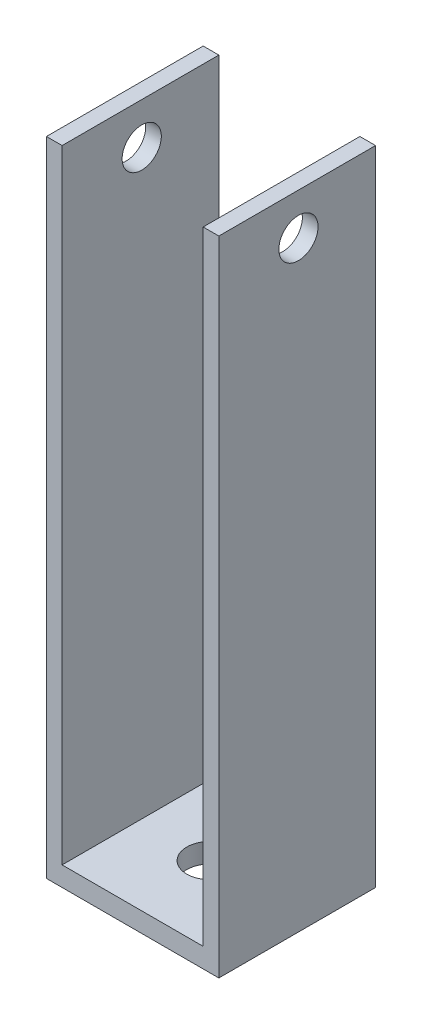
ISO-10303-21;
HEADER;
FILE_DESCRIPTION(('STEP AP214'),'2;1');
FILE_NAME('part.step','',(''),(''),'','','');
FILE_SCHEMA(('AUTOMOTIVE_DESIGN { 1 0 10303 214 1 1 1 1 }'));
ENDSEC;
DATA;
#1=APPLICATION_CONTEXT('core data for automotive mechanical design processes');
#2=APPLICATION_PROTOCOL_DEFINITION('international standard','automotive_design',2000,#1);
#3=PRODUCT_CONTEXT('',#1,'mechanical');
#4=PRODUCT('Part','Part','',(#3));
#5=PRODUCT_RELATED_PRODUCT_CATEGORY('part','',(#4));
#6=PRODUCT_DEFINITION_FORMATION('','',#4);
#7=PRODUCT_DEFINITION_CONTEXT('part definition',#1,'design');
#8=PRODUCT_DEFINITION('design','',#6,#7);
#9=PRODUCT_DEFINITION_SHAPE('','',#8);
#10=(LENGTH_UNIT() NAMED_UNIT(*) SI_UNIT(.MILLI.,.METRE.));
#11=(NAMED_UNIT(*) PLANE_ANGLE_UNIT() SI_UNIT($,.RADIAN.));
#12=(NAMED_UNIT(*) SI_UNIT($,.STERADIAN.) SOLID_ANGLE_UNIT());
#13=UNCERTAINTY_MEASURE_WITH_UNIT(LENGTH_MEASURE(1.E-05),#10,'distance_accuracy_value','');
#14=(GEOMETRIC_REPRESENTATION_CONTEXT(3) GLOBAL_UNCERTAINTY_ASSIGNED_CONTEXT((#13)) GLOBAL_UNIT_ASSIGNED_CONTEXT((#10,
#11,#12)) REPRESENTATION_CONTEXT('',''));
#15=CARTESIAN_POINT('',(0.,0.,0.));
#16=DIRECTION('',(0.,0.,1.));
#17=DIRECTION('',(1.,0.,0.));
#18=AXIS2_PLACEMENT_3D('',#15,#16,#17);
#19=CARTESIAN_POINT('',(0.,2.5,0.));
#20=DIRECTION('',(0.,-1.,0.));
#21=DIRECTION('',(0.,0.,-1.));
#22=AXIS2_PLACEMENT_3D('',#19,#20,#21);
#23=PLANE('',#22);
#24=CARTESIAN_POINT('',(-0.0255617170229101,2.5,0.0639042925574108));
#25=DIRECTION('',(0.,-1.,0.));
#26=DIRECTION('',(0.,0.,-1.));
#27=AXIS2_PLACEMENT_3D('',#24,#25,#26);
#28=CIRCLE('',#27,3.);
#29=CARTESIAN_POINT('',(-0.0255617170229101,2.5,-2.93609570744259));
#30=VERTEX_POINT('',#29);
#31=EDGE_CURVE('E320',#30,#30,#28,.T.);
#32=ORIENTED_EDGE('',*,*,#31,.T.);
#33=EDGE_LOOP('',(#32));
#34=FACE_BOUND('',#33,.T.);
#35=DIRECTION('',(0.,0.,1.));
#36=VECTOR('',#35,1.);
#37=CARTESIAN_POINT('',(9.,2.5,-10.));
#38=LINE('',#37,#36);
#39=CARTESIAN_POINT('',(9.,2.5,-10.));
#40=VERTEX_POINT('',#39);
#41=CARTESIAN_POINT('',(9.,2.5,10.));
#42=VERTEX_POINT('',#41);
#43=EDGE_CURVE('E57',#40,#42,#38,.T.);
#44=ORIENTED_EDGE('',*,*,#43,.F.);
#45=DIRECTION('',(-1.,0.,0.));
#46=VECTOR('',#45,1.);
#47=CARTESIAN_POINT('',(-11.,2.5,-10.));
#48=LINE('',#47,#46);
#49=CARTESIAN_POINT('',(-9.,2.5,-10.));
#50=VERTEX_POINT('',#49);
#51=EDGE_CURVE('E156',#40,#50,#48,.T.);
#52=ORIENTED_EDGE('',*,*,#51,.T.);
#53=DIRECTION('',(0.,0.,-1.));
#54=VECTOR('',#53,1.);
#55=CARTESIAN_POINT('',(-9.,2.5,-10.));
#56=LINE('',#55,#54);
#57=CARTESIAN_POINT('',(-9.,2.5,10.));
#58=VERTEX_POINT('',#57);
#59=EDGE_CURVE('E137',#58,#50,#56,.T.);
#60=ORIENTED_EDGE('',*,*,#59,.F.);
#61=DIRECTION('',(1.,0.,0.));
#62=VECTOR('',#61,1.);
#63=CARTESIAN_POINT('',(-11.,2.5,10.));
#64=LINE('',#63,#62);
#65=EDGE_CURVE('E62',#58,#42,#64,.T.);
#66=ORIENTED_EDGE('',*,*,#65,.T.);
#67=EDGE_LOOP('',(#44,#52,#60,#66));
#68=FACE_BOUND('',#67,.T.);
#69=ADVANCED_FACE('F41',(#34,#68),#23,.F.);
#70=CARTESIAN_POINT('',(11.,2.5,10.));
#71=DIRECTION('',(-1.,0.,0.));
#72=DIRECTION('',(0.,0.,1.));
#73=AXIS2_PLACEMENT_3D('',#70,#71,#72);
#74=PLANE('',#73);
#75=CARTESIAN_POINT('',(11.,76.7008566212072,-0.159142005740934));
#76=DIRECTION('',(-1.,0.,0.));
#77=DIRECTION('',(0.,0.,1.));
#78=AXIS2_PLACEMENT_3D('',#75,#76,#77);
#79=CIRCLE('',#78,2.5);
#80=CARTESIAN_POINT('',(11.,76.7008566212072,2.34085799425907));
#81=VERTEX_POINT('',#80);
#82=EDGE_CURVE('E324',#81,#81,#79,.T.);
#83=ORIENTED_EDGE('',*,*,#82,.T.);
#84=EDGE_LOOP('',(#83));
#85=FACE_BOUND('',#84,.T.);
#86=DIRECTION('',(0.,0.,-1.));
#87=VECTOR('',#86,1.);
#88=CARTESIAN_POINT('',(11.,0.,10.));
#89=LINE('',#88,#87);
#90=CARTESIAN_POINT('',(11.,0.,10.));
#91=VERTEX_POINT('',#90);
#92=CARTESIAN_POINT('',(11.,0.,-10.));
#93=VERTEX_POINT('',#92);
#94=EDGE_CURVE('E110',#91,#93,#89,.T.);
#95=ORIENTED_EDGE('',*,*,#94,.T.);
#96=DIRECTION('',(0.,-1.,0.));
#97=VECTOR('',#96,1.);
#98=CARTESIAN_POINT('',(11.,2.5,-10.));
#99=LINE('',#98,#97);
#100=CARTESIAN_POINT('',(11.,82.,-10.));
#101=VERTEX_POINT('',#100);
#102=EDGE_CURVE('E11',#101,#93,#99,.T.);
#103=ORIENTED_EDGE('',*,*,#102,.F.);
#104=DIRECTION('',(0.,0.,-1.));
#105=VECTOR('',#104,1.);
#106=CARTESIAN_POINT('',(11.,82.,-10.));
#107=LINE('',#106,#105);
#108=CARTESIAN_POINT('',(11.,82.,10.));
#109=VERTEX_POINT('',#108);
#110=EDGE_CURVE('E108',#109,#101,#107,.T.);
#111=ORIENTED_EDGE('',*,*,#110,.F.);
#112=DIRECTION('',(0.,-1.,0.));
#113=VECTOR('',#112,1.);
#114=CARTESIAN_POINT('',(11.,2.5,10.));
#115=LINE('',#114,#113);
#116=EDGE_CURVE('E160',#109,#91,#115,.T.);
#117=ORIENTED_EDGE('',*,*,#116,.T.);
#118=EDGE_LOOP('',(#95,#103,#111,#117));
#119=FACE_BOUND('',#118,.T.);
#120=ADVANCED_FACE('F43',(#85,#119),#74,.F.);
#121=CARTESIAN_POINT('',(-11.,2.5,-10.));
#122=DIRECTION('',(0.,0.,1.));
#123=DIRECTION('',(1.,0.,0.));
#124=AXIS2_PLACEMENT_3D('',#121,#122,#123);
#125=PLANE('',#124);
#126=DIRECTION('',(-1.,0.,0.));
#127=VECTOR('',#126,1.);
#128=CARTESIAN_POINT('',(-11.,0.,-10.));
#129=LINE('',#128,#127);
#130=CARTESIAN_POINT('',(-11.,0.,-10.));
#131=VERTEX_POINT('',#130);
#132=EDGE_CURVE('E162',#93,#131,#129,.T.);
#133=ORIENTED_EDGE('',*,*,#132,.T.);
#134=DIRECTION('',(0.,-1.,0.));
#135=VECTOR('',#134,1.);
#136=CARTESIAN_POINT('',(-11.,2.5,-10.));
#137=LINE('',#136,#135);
#138=CARTESIAN_POINT('',(-11.,82.,-10.));
#139=VERTEX_POINT('',#138);
#140=EDGE_CURVE('E50',#139,#131,#137,.T.);
#141=ORIENTED_EDGE('',*,*,#140,.F.);
#142=DIRECTION('',(-1.,0.,0.));
#143=VECTOR('',#142,1.);
#144=CARTESIAN_POINT('',(-11.,82.,-10.));
#145=LINE('',#144,#143);
#146=CARTESIAN_POINT('',(-9.,82.,-10.));
#147=VERTEX_POINT('',#146);
#148=EDGE_CURVE('E145',#147,#139,#145,.T.);
#149=ORIENTED_EDGE('',*,*,#148,.F.);
#150=DIRECTION('',(0.,-1.,0.));
#151=VECTOR('',#150,1.);
#152=CARTESIAN_POINT('',(-9.,82.,-10.));
#153=LINE('',#152,#151);
#154=EDGE_CURVE('E148',#147,#50,#153,.T.);
#155=ORIENTED_EDGE('',*,*,#154,.T.);
#156=ORIENTED_EDGE('',*,*,#51,.F.);
#157=DIRECTION('',(0.,-1.,0.));
#158=VECTOR('',#157,1.);
#159=CARTESIAN_POINT('',(9.,82.,-10.));
#160=LINE('',#159,#158);
#161=CARTESIAN_POINT('',(9.,82.,-10.));
#162=VERTEX_POINT('',#161);
#163=EDGE_CURVE('E116',#162,#40,#160,.T.);
#164=ORIENTED_EDGE('',*,*,#163,.F.);
#165=DIRECTION('',(-1.,0.,0.));
#166=VECTOR('',#165,1.);
#167=CARTESIAN_POINT('',(11.,82.,-10.));
#168=LINE('',#167,#166);
#169=EDGE_CURVE('E113',#101,#162,#168,.T.);
#170=ORIENTED_EDGE('',*,*,#169,.F.);
#171=ORIENTED_EDGE('',*,*,#102,.T.);
#172=EDGE_LOOP('',(#133,#141,#149,#155,#156,#164,#170,#171));
#173=FACE_BOUND('',#172,.T.);
#174=ADVANCED_FACE('F114',(#173),#125,.F.);
#175=CARTESIAN_POINT('',(-11.,2.5,10.));
#176=DIRECTION('',(1.,0.,0.));
#177=DIRECTION('',(0.,0.,-1.));
#178=AXIS2_PLACEMENT_3D('',#175,#176,#177);
#179=PLANE('',#178);
#180=CARTESIAN_POINT('',(-11.,76.7008566212072,-0.159142005740934));
#181=DIRECTION('',(-1.,0.,0.));
#182=DIRECTION('',(0.,0.,1.));
#183=AXIS2_PLACEMENT_3D('',#180,#181,#182);
#184=CIRCLE('',#183,2.5);
#185=CARTESIAN_POINT('',(-11.,76.7008566212072,2.34085799425907));
#186=VERTEX_POINT('',#185);
#187=EDGE_CURVE('E321',#186,#186,#184,.T.);
#188=ORIENTED_EDGE('',*,*,#187,.F.);
#189=EDGE_LOOP('',(#188));
#190=FACE_BOUND('',#189,.T.);
#191=DIRECTION('',(0.,0.,1.));
#192=VECTOR('',#191,1.);
#193=CARTESIAN_POINT('',(-11.,0.,10.));
#194=LINE('',#193,#192);
#195=CARTESIAN_POINT('',(-11.,0.,10.));
#196=VERTEX_POINT('',#195);
#197=EDGE_CURVE('E164',#131,#196,#194,.T.);
#198=ORIENTED_EDGE('',*,*,#197,.T.);
#199=DIRECTION('',(0.,-1.,0.));
#200=VECTOR('',#199,1.);
#201=CARTESIAN_POINT('',(-11.,2.5,10.));
#202=LINE('',#201,#200);
#203=CARTESIAN_POINT('',(-11.,82.,10.));
#204=VERTEX_POINT('',#203);
#205=EDGE_CURVE('E168',#204,#196,#202,.T.);
#206=ORIENTED_EDGE('',*,*,#205,.F.);
#207=DIRECTION('',(0.,0.,1.));
#208=VECTOR('',#207,1.);
#209=CARTESIAN_POINT('',(-11.,82.,-10.));
#210=LINE('',#209,#208);
#211=EDGE_CURVE('E138',#139,#204,#210,.T.);
#212=ORIENTED_EDGE('',*,*,#211,.F.);
#213=ORIENTED_EDGE('',*,*,#140,.T.);
#214=EDGE_LOOP('',(#198,#206,#212,#213));
#215=FACE_BOUND('',#214,.T.);
#216=ADVANCED_FACE('F175',(#190,#215),#179,.F.);
#217=CARTESIAN_POINT('',(-11.,2.5,10.));
#218=DIRECTION('',(0.,0.,-1.));
#219=DIRECTION('',(-1.,0.,0.));
#220=AXIS2_PLACEMENT_3D('',#217,#218,#219);
#221=PLANE('',#220);
#222=DIRECTION('',(1.,0.,0.));
#223=VECTOR('',#222,1.);
#224=CARTESIAN_POINT('',(-11.,0.,10.));
#225=LINE('',#224,#223);
#226=EDGE_CURVE('E158',#196,#91,#225,.T.);
#227=ORIENTED_EDGE('',*,*,#226,.T.);
#228=ORIENTED_EDGE('',*,*,#116,.F.);
#229=DIRECTION('',(1.,0.,0.));
#230=VECTOR('',#229,1.);
#231=CARTESIAN_POINT('',(11.,82.,10.));
#232=LINE('',#231,#230);
#233=CARTESIAN_POINT('',(9.,82.,10.));
#234=VERTEX_POINT('',#233);
#235=EDGE_CURVE('E124',#234,#109,#232,.T.);
#236=ORIENTED_EDGE('',*,*,#235,.F.);
#237=DIRECTION('',(0.,-1.,0.));
#238=VECTOR('',#237,1.);
#239=CARTESIAN_POINT('',(9.,82.,10.));
#240=LINE('',#239,#238);
#241=EDGE_CURVE('E132',#234,#42,#240,.T.);
#242=ORIENTED_EDGE('',*,*,#241,.T.);
#243=ORIENTED_EDGE('',*,*,#65,.F.);
#244=DIRECTION('',(0.,-1.,0.));
#245=VECTOR('',#244,1.);
#246=CARTESIAN_POINT('',(-9.,82.,10.));
#247=LINE('',#246,#245);
#248=CARTESIAN_POINT('',(-9.,82.,10.));
#249=VERTEX_POINT('',#248);
#250=EDGE_CURVE('E153',#249,#58,#247,.T.);
#251=ORIENTED_EDGE('',*,*,#250,.F.);
#252=DIRECTION('',(1.,0.,0.));
#253=VECTOR('',#252,1.);
#254=CARTESIAN_POINT('',(-11.,82.,10.));
#255=LINE('',#254,#253);
#256=EDGE_CURVE('E141',#204,#249,#255,.T.);
#257=ORIENTED_EDGE('',*,*,#256,.F.);
#258=ORIENTED_EDGE('',*,*,#205,.T.);
#259=EDGE_LOOP('',(#227,#228,#236,#242,#243,#251,#257,#258));
#260=FACE_BOUND('',#259,.T.);
#261=ADVANCED_FACE('F181',(#260),#221,.F.);
#262=CARTESIAN_POINT('',(0.,0.,0.));
#263=DIRECTION('',(0.,-1.,0.));
#264=DIRECTION('',(0.,0.,-1.));
#265=AXIS2_PLACEMENT_3D('',#262,#263,#264);
#266=PLANE('',#265);
#267=CARTESIAN_POINT('',(-0.0255617170229101,0.,0.0639042925574108));
#268=DIRECTION('',(0.,-1.,0.));
#269=DIRECTION('',(0.,0.,-1.));
#270=AXIS2_PLACEMENT_3D('',#267,#268,#269);
#271=CIRCLE('',#270,3.);
#272=CARTESIAN_POINT('',(-0.0255617170229101,0.,-2.93609570744259));
#273=VERTEX_POINT('',#272);
#274=EDGE_CURVE('E318',#273,#273,#271,.T.);
#275=ORIENTED_EDGE('',*,*,#274,.F.);
#276=EDGE_LOOP('',(#275));
#277=FACE_BOUND('',#276,.T.);
#278=ORIENTED_EDGE('',*,*,#94,.F.);
#279=ORIENTED_EDGE('',*,*,#226,.F.);
#280=ORIENTED_EDGE('',*,*,#197,.F.);
#281=ORIENTED_EDGE('',*,*,#132,.F.);
#282=EDGE_LOOP('',(#278,#279,#280,#281));
#283=FACE_BOUND('',#282,.T.);
#284=ADVANCED_FACE('F179',(#277,#283),#266,.T.);
#285=CARTESIAN_POINT('',(-9.,82.,-10.));
#286=DIRECTION('',(-1.,0.,0.));
#287=DIRECTION('',(0.,0.,1.));
#288=AXIS2_PLACEMENT_3D('',#285,#286,#287);
#289=PLANE('',#288);
#290=CARTESIAN_POINT('',(-9.,76.7008566212072,-0.159142005740934));
#291=DIRECTION('',(-1.,0.,0.));
#292=DIRECTION('',(0.,0.,1.));
#293=AXIS2_PLACEMENT_3D('',#290,#291,#292);
#294=CIRCLE('',#293,2.5);
#295=CARTESIAN_POINT('',(-9.,76.7008566212072,2.34085799425907));
#296=VERTEX_POINT('',#295);
#297=EDGE_CURVE('E126',#296,#296,#294,.T.);
#298=ORIENTED_EDGE('',*,*,#297,.T.);
#299=EDGE_LOOP('',(#298));
#300=FACE_BOUND('',#299,.T.);
#301=ORIENTED_EDGE('',*,*,#59,.T.);
#302=ORIENTED_EDGE('',*,*,#154,.F.);
#303=DIRECTION('',(0.,0.,-1.));
#304=VECTOR('',#303,1.);
#305=CARTESIAN_POINT('',(-9.,82.,-10.));
#306=LINE('',#305,#304);
#307=EDGE_CURVE('E143',#249,#147,#306,.T.);
#308=ORIENTED_EDGE('',*,*,#307,.F.);
#309=ORIENTED_EDGE('',*,*,#250,.T.);
#310=EDGE_LOOP('',(#301,#302,#308,#309));
#311=FACE_BOUND('',#310,.T.);
#312=ADVANCED_FACE('F189',(#300,#311),#289,.F.);
#313=CARTESIAN_POINT('',(0.,82.,0.));
#314=DIRECTION('',(0.,1.,0.));
#315=DIRECTION('',(0.,0.,1.));
#316=AXIS2_PLACEMENT_3D('',#313,#314,#315);
#317=PLANE('',#316);
#318=ORIENTED_EDGE('',*,*,#211,.T.);
#319=ORIENTED_EDGE('',*,*,#256,.T.);
#320=ORIENTED_EDGE('',*,*,#307,.T.);
#321=ORIENTED_EDGE('',*,*,#148,.T.);
#322=EDGE_LOOP('',(#318,#319,#320,#321));
#323=FACE_BOUND('',#322,.T.);
#324=ADVANCED_FACE('F186',(#323),#317,.T.);
#325=CARTESIAN_POINT('',(9.,82.,-10.));
#326=DIRECTION('',(1.,0.,0.));
#327=DIRECTION('',(0.,0.,-1.));
#328=AXIS2_PLACEMENT_3D('',#325,#326,#327);
#329=PLANE('',#328);
#330=CARTESIAN_POINT('',(9.,76.7008566212072,-0.159142005740934));
#331=DIRECTION('',(1.,0.,0.));
#332=DIRECTION('',(0.,0.,-1.));
#333=AXIS2_PLACEMENT_3D('',#330,#331,#332);
#334=CIRCLE('',#333,2.5);
#335=CARTESIAN_POINT('',(9.,76.7008566212072,-2.65914200574093));
#336=VERTEX_POINT('',#335);
#337=EDGE_CURVE('E45',#336,#336,#334,.T.);
#338=ORIENTED_EDGE('',*,*,#337,.T.);
#339=EDGE_LOOP('',(#338));
#340=FACE_BOUND('',#339,.T.);
#341=ORIENTED_EDGE('',*,*,#43,.T.);
#342=ORIENTED_EDGE('',*,*,#241,.F.);
#343=DIRECTION('',(0.,0.,1.));
#344=VECTOR('',#343,1.);
#345=CARTESIAN_POINT('',(9.,82.,-10.));
#346=LINE('',#345,#344);
#347=EDGE_CURVE('E119',#162,#234,#346,.T.);
#348=ORIENTED_EDGE('',*,*,#347,.F.);
#349=ORIENTED_EDGE('',*,*,#163,.T.);
#350=EDGE_LOOP('',(#341,#342,#348,#349));
#351=FACE_BOUND('',#350,.T.);
#352=ADVANCED_FACE('F192',(#340,#351),#329,.F.);
#353=CARTESIAN_POINT('',(0.,82.,0.));
#354=DIRECTION('',(0.,-1.,0.));
#355=DIRECTION('',(0.,0.,-1.));
#356=AXIS2_PLACEMENT_3D('',#353,#354,#355);
#357=PLANE('',#356);
#358=ORIENTED_EDGE('',*,*,#110,.T.);
#359=ORIENTED_EDGE('',*,*,#169,.T.);
#360=ORIENTED_EDGE('',*,*,#347,.T.);
#361=ORIENTED_EDGE('',*,*,#235,.T.);
#362=EDGE_LOOP('',(#358,#359,#360,#361));
#363=FACE_BOUND('',#362,.T.);
#364=ADVANCED_FACE('F122',(#363),#357,.F.);
#365=CARTESIAN_POINT('',(11.,76.7008566212072,-0.159142005740934));
#366=DIRECTION('',(-1.,0.,0.));
#367=DIRECTION('',(0.,0.,1.));
#368=AXIS2_PLACEMENT_3D('',#365,#366,#367);
#369=CYLINDRICAL_SURFACE('',#368,2.5);
#370=ORIENTED_EDGE('',*,*,#82,.F.);
#371=EDGE_LOOP('',(#370));
#372=FACE_BOUND('',#371,.T.);
#373=ORIENTED_EDGE('',*,*,#337,.F.);
#374=EDGE_LOOP('',(#373));
#375=FACE_BOUND('',#374,.T.);
#376=ADVANCED_FACE('F200',(#372,#375),#369,.F.);
#377=ORIENTED_EDGE('',*,*,#187,.T.);
#378=EDGE_LOOP('',(#377));
#379=FACE_BOUND('',#378,.T.);
#380=ORIENTED_EDGE('',*,*,#297,.F.);
#381=EDGE_LOOP('',(#380));
#382=FACE_BOUND('',#381,.T.);
#383=ADVANCED_FACE('F294',(#379,#382),#369,.F.);
#384=CARTESIAN_POINT('',(-0.0255617170229101,82.,0.0639042925574108));
#385=DIRECTION('',(0.,-1.,0.));
#386=DIRECTION('',(0.,0.,-1.));
#387=AXIS2_PLACEMENT_3D('',#384,#385,#386);
#388=CYLINDRICAL_SURFACE('',#387,3.);
#389=ORIENTED_EDGE('',*,*,#274,.T.);
#390=EDGE_LOOP('',(#389));
#391=FACE_BOUND('',#390,.T.);
#392=ORIENTED_EDGE('',*,*,#31,.F.);
#393=EDGE_LOOP('',(#392));
#394=FACE_BOUND('',#393,.T.);
#395=ADVANCED_FACE('F302',(#391,#394),#388,.F.);
#396=CLOSED_SHELL('',(#69,#120,#174,#216,#261,#284,#312,#324,#352,#364,#376,#383,#395));
#397=MANIFOLD_SOLID_BREP('B2',#396);
#398=ADVANCED_BREP_SHAPE_REPRESENTATION('',(#18,#397),#14);
#399=SHAPE_DEFINITION_REPRESENTATION(#9,#398);
ENDSEC;
END-ISO-10303-21;
